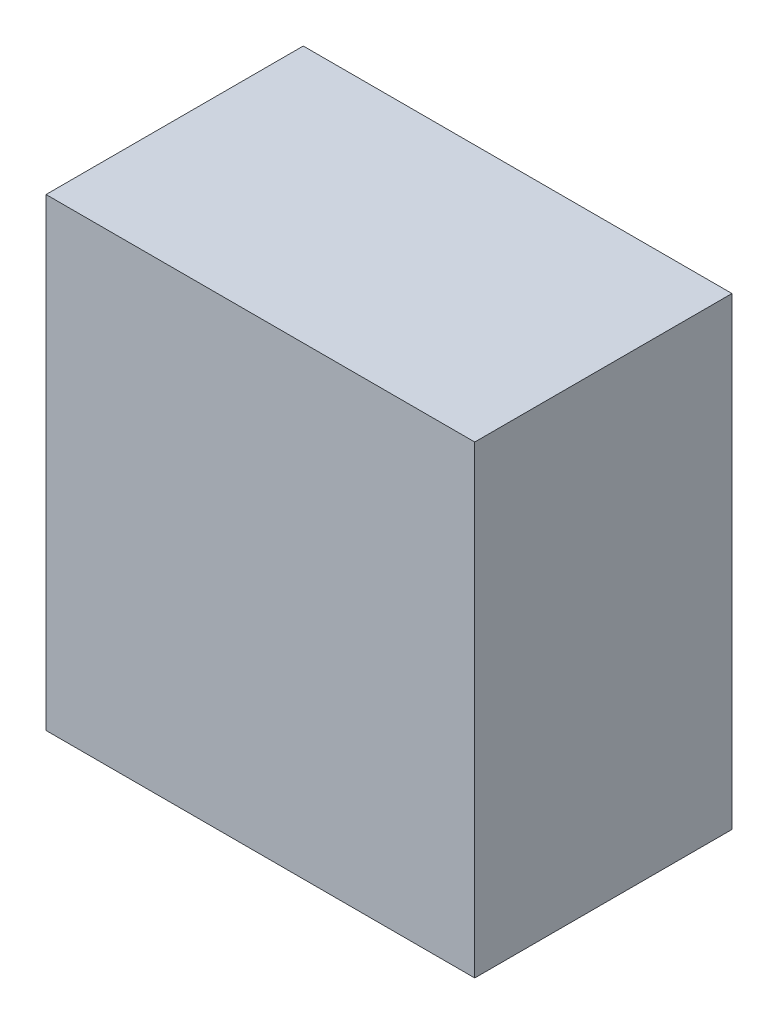
ISO-10303-21;
HEADER;
FILE_DESCRIPTION(('STEP AP214'),'2;1');
FILE_NAME('part.step','',(''),(''),'','','');
FILE_SCHEMA(('AUTOMOTIVE_DESIGN { 1 0 10303 214 1 1 1 1 }'));
ENDSEC;
DATA;
#1=APPLICATION_CONTEXT('core data for automotive mechanical design processes');
#2=APPLICATION_PROTOCOL_DEFINITION('international standard','automotive_design',2000,#1);
#3=PRODUCT_CONTEXT('',#1,'mechanical');
#4=PRODUCT('Part','Part','',(#3));
#5=PRODUCT_RELATED_PRODUCT_CATEGORY('part','',(#4));
#6=PRODUCT_DEFINITION_FORMATION('','',#4);
#7=PRODUCT_DEFINITION_CONTEXT('part definition',#1,'design');
#8=PRODUCT_DEFINITION('design','',#6,#7);
#9=PRODUCT_DEFINITION_SHAPE('','',#8);
#10=(LENGTH_UNIT() NAMED_UNIT(*) SI_UNIT(.MILLI.,.METRE.));
#11=(NAMED_UNIT(*) PLANE_ANGLE_UNIT() SI_UNIT($,.RADIAN.));
#12=(NAMED_UNIT(*) SI_UNIT($,.STERADIAN.) SOLID_ANGLE_UNIT());
#13=UNCERTAINTY_MEASURE_WITH_UNIT(LENGTH_MEASURE(1.E-05),#10,'distance_accuracy_value','');
#14=(GEOMETRIC_REPRESENTATION_CONTEXT(3) GLOBAL_UNCERTAINTY_ASSIGNED_CONTEXT((#13)) GLOBAL_UNIT_ASSIGNED_CONTEXT((#10,
#11,#12)) REPRESENTATION_CONTEXT('',''));
#15=CARTESIAN_POINT('',(0.,0.,0.));
#16=DIRECTION('',(0.,0.,1.));
#17=DIRECTION('',(1.,0.,0.));
#18=AXIS2_PLACEMENT_3D('',#15,#16,#17);
#19=CARTESIAN_POINT('',(305.,-52.21,87.));
#20=DIRECTION('',(-1.,0.,0.));
#21=DIRECTION('',(0.,0.,1.));
#22=AXIS2_PLACEMENT_3D('',#19,#20,#21);
#23=PLANE('',#22);
#24=DIRECTION('',(0.,1.,0.));
#25=VECTOR('',#24,1.);
#26=CARTESIAN_POINT('',(305.,-52.21,0.));
#27=LINE('',#26,#25);
#28=CARTESIAN_POINT('',(305.,-52.21,0.));
#29=VERTEX_POINT('',#28);
#30=CARTESIAN_POINT('',(305.,104.79,0.));
#31=VERTEX_POINT('',#30);
#32=EDGE_CURVE('E96',#29,#31,#27,.T.);
#33=ORIENTED_EDGE('',*,*,#32,.T.);
#34=DIRECTION('',(0.,0.,-1.));
#35=VECTOR('',#34,1.);
#36=CARTESIAN_POINT('',(305.,104.79,87.));
#37=LINE('',#36,#35);
#38=CARTESIAN_POINT('',(305.,104.79,87.));
#39=VERTEX_POINT('',#38);
#40=EDGE_CURVE('E11',#39,#31,#37,.T.);
#41=ORIENTED_EDGE('',*,*,#40,.F.);
#42=DIRECTION('',(0.,1.,0.));
#43=VECTOR('',#42,1.);
#44=CARTESIAN_POINT('',(305.,-52.21,87.));
#45=LINE('',#44,#43);
#46=CARTESIAN_POINT('',(305.,-52.21,87.));
#47=VERTEX_POINT('',#46);
#48=EDGE_CURVE('E84',#47,#39,#45,.T.);
#49=ORIENTED_EDGE('',*,*,#48,.F.);
#50=DIRECTION('',(0.,0.,-1.));
#51=VECTOR('',#50,1.);
#52=CARTESIAN_POINT('',(305.,-52.21,87.));
#53=LINE('',#52,#51);
#54=EDGE_CURVE('E92',#47,#29,#53,.T.);
#55=ORIENTED_EDGE('',*,*,#54,.T.);
#56=EDGE_LOOP('',(#33,#41,#49,#55));
#57=FACE_BOUND('',#56,.T.);
#58=ADVANCED_FACE('F33',(#57),#23,.F.);
#59=CARTESIAN_POINT('',(305.,104.79,87.));
#60=DIRECTION('',(0.,-1.,0.));
#61=DIRECTION('',(1.,0.,0.));
#62=AXIS2_PLACEMENT_3D('',#59,#60,#61);
#63=PLANE('',#62);
#64=DIRECTION('',(-1.,0.,0.));
#65=VECTOR('',#64,1.);
#66=CARTESIAN_POINT('',(305.,104.79,0.));
#67=LINE('',#66,#65);
#68=CARTESIAN_POINT('',(160.,104.79,0.));
#69=VERTEX_POINT('',#68);
#70=EDGE_CURVE('E88',#31,#69,#67,.T.);
#71=ORIENTED_EDGE('',*,*,#70,.T.);
#72=DIRECTION('',(0.,0.,-1.));
#73=VECTOR('',#72,1.);
#74=CARTESIAN_POINT('',(160.,104.79,87.));
#75=LINE('',#74,#73);
#76=CARTESIAN_POINT('',(160.,104.79,87.));
#77=VERTEX_POINT('',#76);
#78=EDGE_CURVE('E41',#77,#69,#75,.T.);
#79=ORIENTED_EDGE('',*,*,#78,.F.);
#80=DIRECTION('',(-1.,0.,0.));
#81=VECTOR('',#80,1.);
#82=CARTESIAN_POINT('',(305.,104.79,87.));
#83=LINE('',#82,#81);
#84=EDGE_CURVE('E79',#39,#77,#83,.T.);
#85=ORIENTED_EDGE('',*,*,#84,.F.);
#86=ORIENTED_EDGE('',*,*,#40,.T.);
#87=EDGE_LOOP('',(#71,#79,#85,#86));
#88=FACE_BOUND('',#87,.T.);
#89=ADVANCED_FACE('F87',(#88),#63,.F.);
#90=CARTESIAN_POINT('',(160.,-52.21,87.));
#91=DIRECTION('',(1.,0.,0.));
#92=DIRECTION('',(0.,0.,-1.));
#93=AXIS2_PLACEMENT_3D('',#90,#91,#92);
#94=PLANE('',#93);
#95=DIRECTION('',(0.,-1.,0.));
#96=VECTOR('',#95,1.);
#97=CARTESIAN_POINT('',(160.,-52.21,0.));
#98=LINE('',#97,#96);
#99=CARTESIAN_POINT('',(160.,-52.21,0.));
#100=VERTEX_POINT('',#99);
#101=EDGE_CURVE('E66',#69,#100,#98,.T.);
#102=ORIENTED_EDGE('',*,*,#101,.T.);
#103=DIRECTION('',(0.,0.,-1.));
#104=VECTOR('',#103,1.);
#105=CARTESIAN_POINT('',(160.,-52.21,87.));
#106=LINE('',#105,#104);
#107=CARTESIAN_POINT('',(160.,-52.21,87.));
#108=VERTEX_POINT('',#107);
#109=EDGE_CURVE('E89',#108,#100,#106,.T.);
#110=ORIENTED_EDGE('',*,*,#109,.F.);
#111=DIRECTION('',(0.,-1.,0.));
#112=VECTOR('',#111,1.);
#113=CARTESIAN_POINT('',(160.,-52.21,87.));
#114=LINE('',#113,#112);
#115=EDGE_CURVE('E82',#77,#108,#114,.T.);
#116=ORIENTED_EDGE('',*,*,#115,.F.);
#117=ORIENTED_EDGE('',*,*,#78,.T.);
#118=EDGE_LOOP('',(#102,#110,#116,#117));
#119=FACE_BOUND('',#118,.T.);
#120=ADVANCED_FACE('F90',(#119),#94,.F.);
#121=CARTESIAN_POINT('',(305.,-52.21,87.));
#122=DIRECTION('',(0.,1.,0.));
#123=DIRECTION('',(0.,0.,1.));
#124=AXIS2_PLACEMENT_3D('',#121,#122,#123);
#125=PLANE('',#124);
#126=DIRECTION('',(1.,0.,0.));
#127=VECTOR('',#126,1.);
#128=CARTESIAN_POINT('',(305.,-52.21,0.));
#129=LINE('',#128,#127);
#130=EDGE_CURVE('E72',#100,#29,#129,.T.);
#131=ORIENTED_EDGE('',*,*,#130,.T.);
#132=ORIENTED_EDGE('',*,*,#54,.F.);
#133=DIRECTION('',(1.,0.,0.));
#134=VECTOR('',#133,1.);
#135=CARTESIAN_POINT('',(305.,-52.21,87.));
#136=LINE('',#135,#134);
#137=EDGE_CURVE('E49',#108,#47,#136,.T.);
#138=ORIENTED_EDGE('',*,*,#137,.F.);
#139=ORIENTED_EDGE('',*,*,#109,.T.);
#140=EDGE_LOOP('',(#131,#132,#138,#139));
#141=FACE_BOUND('',#140,.T.);
#142=ADVANCED_FACE('F103',(#141),#125,.F.);
#143=CARTESIAN_POINT('',(305.,104.79,87.));
#144=DIRECTION('',(0.,0.,1.));
#145=DIRECTION('',(1.,0.,0.));
#146=AXIS2_PLACEMENT_3D('',#143,#144,#145);
#147=PLANE('',#146);
#148=ORIENTED_EDGE('',*,*,#48,.T.);
#149=ORIENTED_EDGE('',*,*,#84,.T.);
#150=ORIENTED_EDGE('',*,*,#115,.T.);
#151=ORIENTED_EDGE('',*,*,#137,.T.);
#152=EDGE_LOOP('',(#148,#149,#150,#151));
#153=FACE_BOUND('',#152,.T.);
#154=ADVANCED_FACE('F80',(#153),#147,.T.);
#155=CARTESIAN_POINT('',(305.,104.79,0.));
#156=DIRECTION('',(0.,0.,1.));
#157=DIRECTION('',(1.,0.,0.));
#158=AXIS2_PLACEMENT_3D('',#155,#156,#157);
#159=PLANE('',#158);
#160=ORIENTED_EDGE('',*,*,#32,.F.);
#161=ORIENTED_EDGE('',*,*,#130,.F.);
#162=ORIENTED_EDGE('',*,*,#101,.F.);
#163=ORIENTED_EDGE('',*,*,#70,.F.);
#164=EDGE_LOOP('',(#160,#161,#162,#163));
#165=FACE_BOUND('',#164,.T.);
#166=ADVANCED_FACE('F106',(#165),#159,.F.);
#167=CLOSED_SHELL('',(#58,#89,#120,#142,#154,#166));
#168=MANIFOLD_SOLID_BREP('B2',#167);
#169=ADVANCED_BREP_SHAPE_REPRESENTATION('',(#18,#168),#14);
#170=SHAPE_DEFINITION_REPRESENTATION(#9,#169);
ENDSEC;
END-ISO-10303-21;
